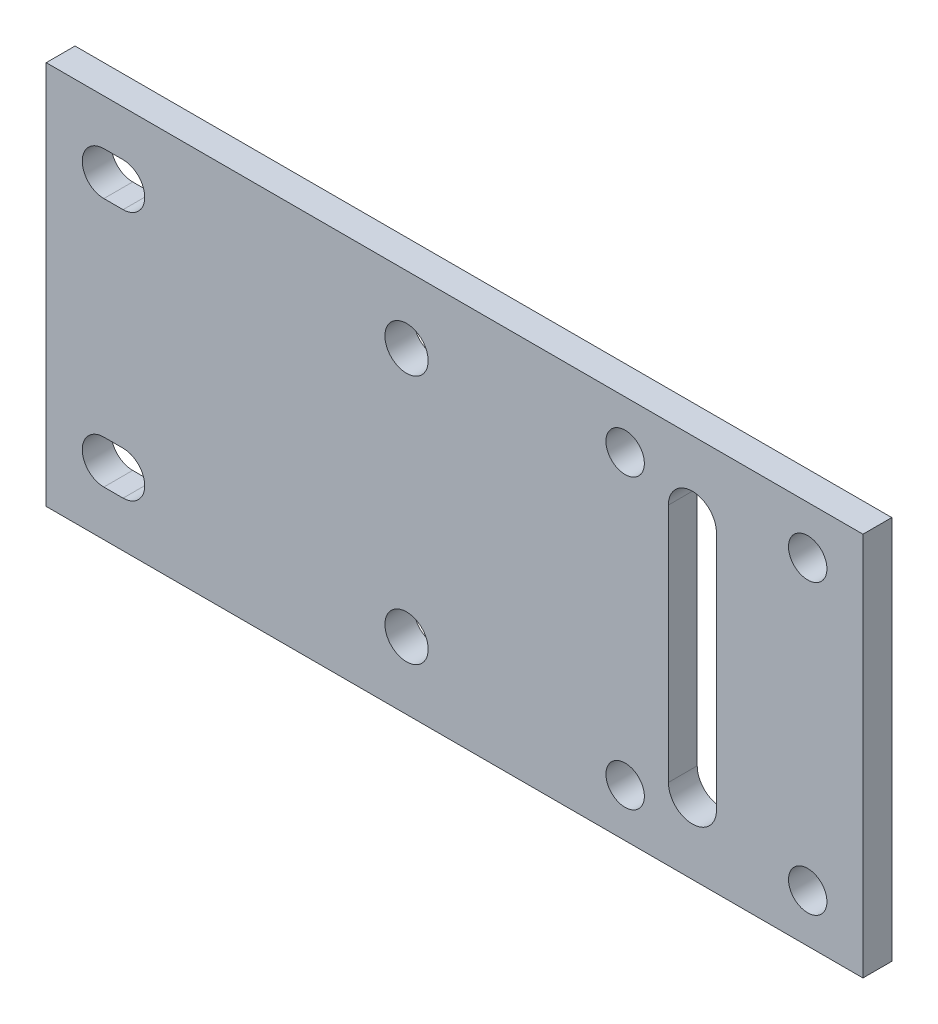
ISO-10303-21;
HEADER;
FILE_DESCRIPTION(('STEP AP214'),'2;1');
FILE_NAME('part.step','',(''),(''),'','','');
FILE_SCHEMA(('AUTOMOTIVE_DESIGN { 1 0 10303 214 1 1 1 1 }'));
ENDSEC;
DATA;
#1=APPLICATION_CONTEXT('core data for automotive mechanical design processes');
#2=APPLICATION_PROTOCOL_DEFINITION('international standard','automotive_design',2000,#1);
#3=PRODUCT_CONTEXT('',#1,'mechanical');
#4=PRODUCT('Part','Part','',(#3));
#5=PRODUCT_RELATED_PRODUCT_CATEGORY('part','',(#4));
#6=PRODUCT_DEFINITION_FORMATION('','',#4);
#7=PRODUCT_DEFINITION_CONTEXT('part definition',#1,'design');
#8=PRODUCT_DEFINITION('design','',#6,#7);
#9=PRODUCT_DEFINITION_SHAPE('','',#8);
#10=(LENGTH_UNIT() NAMED_UNIT(*) SI_UNIT(.MILLI.,.METRE.));
#11=(NAMED_UNIT(*) PLANE_ANGLE_UNIT() SI_UNIT($,.RADIAN.));
#12=(NAMED_UNIT(*) SI_UNIT($,.STERADIAN.) SOLID_ANGLE_UNIT());
#13=UNCERTAINTY_MEASURE_WITH_UNIT(LENGTH_MEASURE(1.E-05),#10,'distance_accuracy_value','');
#14=(GEOMETRIC_REPRESENTATION_CONTEXT(3) GLOBAL_UNCERTAINTY_ASSIGNED_CONTEXT((#13)) GLOBAL_UNIT_ASSIGNED_CONTEXT((#10,
#11,#12)) REPRESENTATION_CONTEXT('',''));
#15=CARTESIAN_POINT('',(0.,0.,0.));
#16=DIRECTION('',(0.,0.,1.));
#17=DIRECTION('',(1.,0.,0.));
#18=AXIS2_PLACEMENT_3D('',#15,#16,#17);
#19=CARTESIAN_POINT('',(0.,0.,3.));
#20=DIRECTION('',(0.,0.,1.));
#21=DIRECTION('',(1.,0.,0.));
#22=AXIS2_PLACEMENT_3D('',#19,#20,#21);
#23=PLANE('',#22);
#24=CARTESIAN_POINT('',(57.,-15.,3.));
#25=DIRECTION('',(0.,0.,1.));
#26=DIRECTION('',(-1.,0.,0.));
#27=AXIS2_PLACEMENT_3D('',#24,#25,#26);
#28=CIRCLE('',#27,2.);
#29=CARTESIAN_POINT('',(55.,-15.,3.));
#30=VERTEX_POINT('',#29);
#31=EDGE_CURVE('E475',#30,#30,#28,.T.);
#32=ORIENTED_EDGE('',*,*,#31,.F.);
#33=EDGE_LOOP('',(#32));
#34=FACE_BOUND('',#33,.T.);
#35=CARTESIAN_POINT('',(57.,15.,3.));
#36=DIRECTION('',(0.,0.,1.));
#37=DIRECTION('',(1.,0.,0.));
#38=AXIS2_PLACEMENT_3D('',#35,#36,#37);
#39=CIRCLE('',#38,2.);
#40=CARTESIAN_POINT('',(59.,15.,3.));
#41=VERTEX_POINT('',#40);
#42=EDGE_CURVE('E188',#41,#41,#39,.T.);
#43=ORIENTED_EDGE('',*,*,#42,.F.);
#44=EDGE_LOOP('',(#43));
#45=FACE_BOUND('',#44,.T.);
#46=CARTESIAN_POINT('',(15.25,13.,3.));
#47=DIRECTION('',(0.,0.,1.));
#48=DIRECTION('',(1.,0.,0.));
#49=AXIS2_PLACEMENT_3D('',#46,#47,#48);
#50=CIRCLE('',#49,2.25);
#51=CARTESIAN_POINT('',(17.5,13.,3.));
#52=VERTEX_POINT('',#51);
#53=EDGE_CURVE('E298',#52,#52,#50,.T.);
#54=ORIENTED_EDGE('',*,*,#53,.F.);
#55=EDGE_LOOP('',(#54));
#56=FACE_BOUND('',#55,.T.);
#57=DIRECTION('',(0.,-1.,0.));
#58=VECTOR('',#57,1.);
#59=CARTESIAN_POINT('',(-22.25,-20.,3.));
#60=LINE('',#59,#58);
#61=CARTESIAN_POINT('',(-22.25,20.,3.));
#62=VERTEX_POINT('',#61);
#63=CARTESIAN_POINT('',(-22.25,-20.,3.));
#64=VERTEX_POINT('',#63);
#65=EDGE_CURVE('E306',#62,#64,#60,.T.);
#66=ORIENTED_EDGE('',*,*,#65,.T.);
#67=DIRECTION('',(1.,0.,0.));
#68=VECTOR('',#67,1.);
#69=CARTESIAN_POINT('',(62.75,-20.,3.));
#70=LINE('',#69,#68);
#71=CARTESIAN_POINT('',(62.75,-20.,3.));
#72=VERTEX_POINT('',#71);
#73=EDGE_CURVE('E310',#64,#72,#70,.T.);
#74=ORIENTED_EDGE('',*,*,#73,.T.);
#75=DIRECTION('',(0.,1.,0.));
#76=VECTOR('',#75,1.);
#77=CARTESIAN_POINT('',(62.75,-20.,3.));
#78=LINE('',#77,#76);
#79=CARTESIAN_POINT('',(62.75,20.,3.));
#80=VERTEX_POINT('',#79);
#81=EDGE_CURVE('E314',#72,#80,#78,.T.);
#82=ORIENTED_EDGE('',*,*,#81,.T.);
#83=DIRECTION('',(-1.,0.,0.));
#84=VECTOR('',#83,1.);
#85=CARTESIAN_POINT('',(62.75,20.,3.));
#86=LINE('',#85,#84);
#87=EDGE_CURVE('E317',#80,#62,#86,.T.);
#88=ORIENTED_EDGE('',*,*,#87,.T.);
#89=EDGE_LOOP('',(#66,#74,#82,#88));
#90=FACE_BOUND('',#89,.T.);
#91=CARTESIAN_POINT('',(15.25,-13.,3.));
#92=DIRECTION('',(0.,0.,1.));
#93=DIRECTION('',(1.,0.,0.));
#94=AXIS2_PLACEMENT_3D('',#91,#92,#93);
#95=CIRCLE('',#94,2.25);
#96=CARTESIAN_POINT('',(17.5,-13.,3.));
#97=VERTEX_POINT('',#96);
#98=EDGE_CURVE('E290',#97,#97,#95,.T.);
#99=ORIENTED_EDGE('',*,*,#98,.F.);
#100=EDGE_LOOP('',(#99));
#101=FACE_BOUND('',#100,.T.);
#102=DIRECTION('',(-1.,0.,0.));
#103=VECTOR('',#102,1.);
#104=CARTESIAN_POINT('',(-14.25,15.25,3.));
#105=LINE('',#104,#103);
#106=CARTESIAN_POINT('',(-14.25,15.25,3.));
#107=VERTEX_POINT('',#106);
#108=CARTESIAN_POINT('',(-16.25,15.25,3.));
#109=VERTEX_POINT('',#108);
#110=EDGE_CURVE('E250',#107,#109,#105,.T.);
#111=ORIENTED_EDGE('',*,*,#110,.F.);
#112=CARTESIAN_POINT('',(-14.25,13.,3.));
#113=DIRECTION('',(0.,0.,1.));
#114=DIRECTION('',(1.,0.,0.));
#115=AXIS2_PLACEMENT_3D('',#112,#113,#114);
#116=CIRCLE('',#115,2.25);
#117=CARTESIAN_POINT('',(-14.25,10.75,3.));
#118=VERTEX_POINT('',#117);
#119=EDGE_CURVE('E247',#118,#107,#116,.T.);
#120=ORIENTED_EDGE('',*,*,#119,.F.);
#121=DIRECTION('',(1.,0.,0.));
#122=VECTOR('',#121,1.);
#123=CARTESIAN_POINT('',(-14.25,10.75,3.));
#124=LINE('',#123,#122);
#125=CARTESIAN_POINT('',(-16.25,10.75,3.));
#126=VERTEX_POINT('',#125);
#127=EDGE_CURVE('E258',#126,#118,#124,.T.);
#128=ORIENTED_EDGE('',*,*,#127,.F.);
#129=CARTESIAN_POINT('',(-16.25,13.,3.));
#130=DIRECTION('',(0.,0.,1.));
#131=DIRECTION('',(1.,0.,0.));
#132=AXIS2_PLACEMENT_3D('',#129,#130,#131);
#133=CIRCLE('',#132,2.25);
#134=EDGE_CURVE('E254',#109,#126,#133,.T.);
#135=ORIENTED_EDGE('',*,*,#134,.F.);
#136=EDGE_LOOP('',(#111,#120,#128,#135));
#137=FACE_BOUND('',#136,.T.);
#138=DIRECTION('',(-1.,0.,0.));
#139=VECTOR('',#138,1.);
#140=CARTESIAN_POINT('',(-14.25,-10.75,3.));
#141=LINE('',#140,#139);
#142=CARTESIAN_POINT('',(-14.25,-10.75,3.));
#143=VERTEX_POINT('',#142);
#144=CARTESIAN_POINT('',(-16.25,-10.75,3.));
#145=VERTEX_POINT('',#144);
#146=EDGE_CURVE('E207',#143,#145,#141,.T.);
#147=ORIENTED_EDGE('',*,*,#146,.F.);
#148=CARTESIAN_POINT('',(-14.25,-13.,3.));
#149=DIRECTION('',(0.,0.,1.));
#150=DIRECTION('',(1.,0.,0.));
#151=AXIS2_PLACEMENT_3D('',#148,#149,#150);
#152=CIRCLE('',#151,2.25);
#153=CARTESIAN_POINT('',(-14.25,-15.25,3.));
#154=VERTEX_POINT('',#153);
#155=EDGE_CURVE('E204',#154,#143,#152,.T.);
#156=ORIENTED_EDGE('',*,*,#155,.F.);
#157=DIRECTION('',(1.,0.,0.));
#158=VECTOR('',#157,1.);
#159=CARTESIAN_POINT('',(-14.25,-15.25,3.));
#160=LINE('',#159,#158);
#161=CARTESIAN_POINT('',(-16.25,-15.25,3.));
#162=VERTEX_POINT('',#161);
#163=EDGE_CURVE('E215',#162,#154,#160,.T.);
#164=ORIENTED_EDGE('',*,*,#163,.F.);
#165=CARTESIAN_POINT('',(-16.25,-13.,3.));
#166=DIRECTION('',(0.,0.,1.));
#167=DIRECTION('',(1.,0.,0.));
#168=AXIS2_PLACEMENT_3D('',#165,#166,#167);
#169=CIRCLE('',#168,2.25);
#170=EDGE_CURVE('E211',#145,#162,#169,.T.);
#171=ORIENTED_EDGE('',*,*,#170,.F.);
#172=EDGE_LOOP('',(#147,#156,#164,#171));
#173=FACE_BOUND('',#172,.T.);
#174=DIRECTION('',(0.,1.,0.));
#175=VECTOR('',#174,1.);
#176=CARTESIAN_POINT('',(47.5,-12.5,3.));
#177=LINE('',#176,#175);
#178=CARTESIAN_POINT('',(47.5,-12.5,3.));
#179=VERTEX_POINT('',#178);
#180=CARTESIAN_POINT('',(47.5,12.5,3.));
#181=VERTEX_POINT('',#180);
#182=EDGE_CURVE('E162',#179,#181,#177,.T.);
#183=ORIENTED_EDGE('',*,*,#182,.F.);
#184=CARTESIAN_POINT('',(45.,-12.5,3.));
#185=DIRECTION('',(0.,0.,1.));
#186=DIRECTION('',(1.,0.,0.));
#187=AXIS2_PLACEMENT_3D('',#184,#185,#186);
#188=CIRCLE('',#187,2.5);
#189=CARTESIAN_POINT('',(42.5,-12.5,3.));
#190=VERTEX_POINT('',#189);
#191=EDGE_CURVE('E153',#190,#179,#188,.T.);
#192=ORIENTED_EDGE('',*,*,#191,.F.);
#193=DIRECTION('',(0.,-1.,0.));
#194=VECTOR('',#193,1.);
#195=CARTESIAN_POINT('',(42.5,-12.5,3.));
#196=LINE('',#195,#194);
#197=CARTESIAN_POINT('',(42.5,12.5,3.));
#198=VERTEX_POINT('',#197);
#199=EDGE_CURVE('E180',#198,#190,#196,.T.);
#200=ORIENTED_EDGE('',*,*,#199,.F.);
#201=CARTESIAN_POINT('',(45.,12.5,3.));
#202=DIRECTION('',(0.,0.,1.));
#203=DIRECTION('',(1.,0.,0.));
#204=AXIS2_PLACEMENT_3D('',#201,#202,#203);
#205=CIRCLE('',#204,2.5);
#206=EDGE_CURVE('E176',#181,#198,#205,.T.);
#207=ORIENTED_EDGE('',*,*,#206,.F.);
#208=EDGE_LOOP('',(#183,#192,#200,#207));
#209=FACE_BOUND('',#208,.T.);
#210=CARTESIAN_POINT('',(38.,15.,3.));
#211=DIRECTION('',(0.,0.,1.));
#212=DIRECTION('',(1.,0.,0.));
#213=AXIS2_PLACEMENT_3D('',#210,#211,#212);
#214=CIRCLE('',#213,2.);
#215=CARTESIAN_POINT('',(40.,15.,3.));
#216=VERTEX_POINT('',#215);
#217=EDGE_CURVE('E483',#216,#216,#214,.T.);
#218=ORIENTED_EDGE('',*,*,#217,.F.);
#219=EDGE_LOOP('',(#218));
#220=FACE_BOUND('',#219,.T.);
#221=CARTESIAN_POINT('',(38.,-15.,3.));
#222=DIRECTION('',(0.,0.,1.));
#223=DIRECTION('',(-1.,0.,0.));
#224=AXIS2_PLACEMENT_3D('',#221,#222,#223);
#225=CIRCLE('',#224,2.);
#226=CARTESIAN_POINT('',(36.,-15.,3.));
#227=VERTEX_POINT('',#226);
#228=EDGE_CURVE('E464',#227,#227,#225,.T.);
#229=ORIENTED_EDGE('',*,*,#228,.F.);
#230=EDGE_LOOP('',(#229));
#231=FACE_BOUND('',#230,.T.);
#232=ADVANCED_FACE('F39',(#34,#45,#56,#90,#101,#137,#173,#209,#220,#231),#23,.T.);
#233=CARTESIAN_POINT('',(0.,0.,0.));
#234=DIRECTION('',(0.,0.,1.));
#235=DIRECTION('',(1.,0.,0.));
#236=AXIS2_PLACEMENT_3D('',#233,#234,#235);
#237=PLANE('',#236);
#238=CARTESIAN_POINT('',(-14.25,-13.,0.));
#239=DIRECTION('',(0.,0.,1.));
#240=DIRECTION('',(1.,0.,0.));
#241=AXIS2_PLACEMENT_3D('',#238,#239,#240);
#242=CIRCLE('',#241,2.25);
#243=CARTESIAN_POINT('',(-14.25,-15.25,0.));
#244=VERTEX_POINT('',#243);
#245=CARTESIAN_POINT('',(-14.25,-10.75,0.));
#246=VERTEX_POINT('',#245);
#247=EDGE_CURVE('E171',#244,#246,#242,.T.);
#248=ORIENTED_EDGE('',*,*,#247,.T.);
#249=DIRECTION('',(-1.,0.,0.));
#250=VECTOR('',#249,1.);
#251=CARTESIAN_POINT('',(-14.25,-10.75,0.));
#252=LINE('',#251,#250);
#253=CARTESIAN_POINT('',(-16.25,-10.75,0.));
#254=VERTEX_POINT('',#253);
#255=EDGE_CURVE('E222',#246,#254,#252,.T.);
#256=ORIENTED_EDGE('',*,*,#255,.T.);
#257=CARTESIAN_POINT('',(-16.25,-13.,0.));
#258=DIRECTION('',(0.,0.,1.));
#259=DIRECTION('',(1.,0.,0.));
#260=AXIS2_PLACEMENT_3D('',#257,#258,#259);
#261=CIRCLE('',#260,2.25);
#262=CARTESIAN_POINT('',(-16.25,-15.25,0.));
#263=VERTEX_POINT('',#262);
#264=EDGE_CURVE('E226',#254,#263,#261,.T.);
#265=ORIENTED_EDGE('',*,*,#264,.T.);
#266=DIRECTION('',(1.,0.,0.));
#267=VECTOR('',#266,1.);
#268=CARTESIAN_POINT('',(-14.25,-15.25,0.));
#269=LINE('',#268,#267);
#270=EDGE_CURVE('E208',#263,#244,#269,.T.);
#271=ORIENTED_EDGE('',*,*,#270,.T.);
#272=EDGE_LOOP('',(#248,#256,#265,#271));
#273=FACE_BOUND('',#272,.T.);
#274=CARTESIAN_POINT('',(15.25,-13.,0.));
#275=DIRECTION('',(0.,0.,1.));
#276=DIRECTION('',(1.,0.,0.));
#277=AXIS2_PLACEMENT_3D('',#274,#275,#276);
#278=CIRCLE('',#277,2.25);
#279=CARTESIAN_POINT('',(17.5,-13.,0.));
#280=VERTEX_POINT('',#279);
#281=EDGE_CURVE('E289',#280,#280,#278,.T.);
#282=ORIENTED_EDGE('',*,*,#281,.T.);
#283=EDGE_LOOP('',(#282));
#284=FACE_BOUND('',#283,.T.);
#285=CARTESIAN_POINT('',(15.25,13.,0.));
#286=DIRECTION('',(0.,0.,1.));
#287=DIRECTION('',(1.,0.,0.));
#288=AXIS2_PLACEMENT_3D('',#285,#286,#287);
#289=CIRCLE('',#288,2.25);
#290=CARTESIAN_POINT('',(17.5,13.,0.));
#291=VERTEX_POINT('',#290);
#292=EDGE_CURVE('E294',#291,#291,#289,.T.);
#293=ORIENTED_EDGE('',*,*,#292,.T.);
#294=EDGE_LOOP('',(#293));
#295=FACE_BOUND('',#294,.T.);
#296=DIRECTION('',(0.,-1.,0.));
#297=VECTOR('',#296,1.);
#298=CARTESIAN_POINT('',(-22.25,-20.,0.));
#299=LINE('',#298,#297);
#300=CARTESIAN_POINT('',(-22.25,20.,0.));
#301=VERTEX_POINT('',#300);
#302=CARTESIAN_POINT('',(-22.25,-20.,0.));
#303=VERTEX_POINT('',#302);
#304=EDGE_CURVE('E302',#301,#303,#299,.T.);
#305=ORIENTED_EDGE('',*,*,#304,.F.);
#306=DIRECTION('',(-1.,0.,0.));
#307=VECTOR('',#306,1.);
#308=CARTESIAN_POINT('',(62.75,20.,0.));
#309=LINE('',#308,#307);
#310=CARTESIAN_POINT('',(62.75,20.,0.));
#311=VERTEX_POINT('',#310);
#312=EDGE_CURVE('E311',#311,#301,#309,.T.);
#313=ORIENTED_EDGE('',*,*,#312,.F.);
#314=DIRECTION('',(0.,1.,0.));
#315=VECTOR('',#314,1.);
#316=CARTESIAN_POINT('',(62.75,-20.,0.));
#317=LINE('',#316,#315);
#318=CARTESIAN_POINT('',(62.75,-20.,0.));
#319=VERTEX_POINT('',#318);
#320=EDGE_CURVE('E327',#319,#311,#317,.T.);
#321=ORIENTED_EDGE('',*,*,#320,.F.);
#322=DIRECTION('',(1.,0.,0.));
#323=VECTOR('',#322,1.);
#324=CARTESIAN_POINT('',(62.75,-20.,0.));
#325=LINE('',#324,#323);
#326=EDGE_CURVE('E324',#303,#319,#325,.T.);
#327=ORIENTED_EDGE('',*,*,#326,.F.);
#328=EDGE_LOOP('',(#305,#313,#321,#327));
#329=FACE_BOUND('',#328,.T.);
#330=CARTESIAN_POINT('',(-14.25,13.,0.));
#331=DIRECTION('',(0.,0.,1.));
#332=DIRECTION('',(1.,0.,0.));
#333=AXIS2_PLACEMENT_3D('',#330,#331,#332);
#334=CIRCLE('',#333,2.25);
#335=CARTESIAN_POINT('',(-14.25,10.75,0.));
#336=VERTEX_POINT('',#335);
#337=CARTESIAN_POINT('',(-14.25,15.25,0.));
#338=VERTEX_POINT('',#337);
#339=EDGE_CURVE('E246',#336,#338,#334,.T.);
#340=ORIENTED_EDGE('',*,*,#339,.T.);
#341=DIRECTION('',(-1.,0.,0.));
#342=VECTOR('',#341,1.);
#343=CARTESIAN_POINT('',(-14.25,15.25,0.));
#344=LINE('',#343,#342);
#345=CARTESIAN_POINT('',(-16.25,15.25,0.));
#346=VERTEX_POINT('',#345);
#347=EDGE_CURVE('E265',#338,#346,#344,.T.);
#348=ORIENTED_EDGE('',*,*,#347,.T.);
#349=CARTESIAN_POINT('',(-16.25,13.,0.));
#350=DIRECTION('',(0.,0.,1.));
#351=DIRECTION('',(1.,0.,0.));
#352=AXIS2_PLACEMENT_3D('',#349,#350,#351);
#353=CIRCLE('',#352,2.25);
#354=CARTESIAN_POINT('',(-16.25,10.75,0.));
#355=VERTEX_POINT('',#354);
#356=EDGE_CURVE('E269',#346,#355,#353,.T.);
#357=ORIENTED_EDGE('',*,*,#356,.T.);
#358=DIRECTION('',(1.,0.,0.));
#359=VECTOR('',#358,1.);
#360=CARTESIAN_POINT('',(-14.25,10.75,0.));
#361=LINE('',#360,#359);
#362=EDGE_CURVE('E251',#355,#336,#361,.T.);
#363=ORIENTED_EDGE('',*,*,#362,.T.);
#364=EDGE_LOOP('',(#340,#348,#357,#363));
#365=FACE_BOUND('',#364,.T.);
#366=CARTESIAN_POINT('',(45.,-12.5,0.));
#367=DIRECTION('',(0.,0.,1.));
#368=DIRECTION('',(1.,0.,0.));
#369=AXIS2_PLACEMENT_3D('',#366,#367,#368);
#370=CIRCLE('',#369,2.5);
#371=CARTESIAN_POINT('',(42.5,-12.5,0.));
#372=VERTEX_POINT('',#371);
#373=CARTESIAN_POINT('',(47.5,-12.5,0.));
#374=VERTEX_POINT('',#373);
#375=EDGE_CURVE('E63',#372,#374,#370,.T.);
#376=ORIENTED_EDGE('',*,*,#375,.T.);
#377=DIRECTION('',(0.,1.,0.));
#378=VECTOR('',#377,1.);
#379=CARTESIAN_POINT('',(47.5,-12.5,0.));
#380=LINE('',#379,#378);
#381=CARTESIAN_POINT('',(47.5,12.5,0.));
#382=VERTEX_POINT('',#381);
#383=EDGE_CURVE('E169',#374,#382,#380,.T.);
#384=ORIENTED_EDGE('',*,*,#383,.T.);
#385=CARTESIAN_POINT('',(45.,12.5,0.));
#386=DIRECTION('',(0.,0.,1.));
#387=DIRECTION('',(1.,0.,0.));
#388=AXIS2_PLACEMENT_3D('',#385,#386,#387);
#389=CIRCLE('',#388,2.5);
#390=CARTESIAN_POINT('',(42.5,12.5,0.));
#391=VERTEX_POINT('',#390);
#392=EDGE_CURVE('E191',#382,#391,#389,.T.);
#393=ORIENTED_EDGE('',*,*,#392,.T.);
#394=DIRECTION('',(0.,-1.,0.));
#395=VECTOR('',#394,1.);
#396=CARTESIAN_POINT('',(42.5,-12.5,0.));
#397=LINE('',#396,#395);
#398=EDGE_CURVE('E163',#391,#372,#397,.T.);
#399=ORIENTED_EDGE('',*,*,#398,.T.);
#400=EDGE_LOOP('',(#376,#384,#393,#399));
#401=FACE_BOUND('',#400,.T.);
#402=CARTESIAN_POINT('',(57.,15.,0.));
#403=DIRECTION('',(0.,0.,1.));
#404=DIRECTION('',(1.,0.,0.));
#405=AXIS2_PLACEMENT_3D('',#402,#403,#404);
#406=CIRCLE('',#405,2.);
#407=CARTESIAN_POINT('',(59.,15.,0.));
#408=VERTEX_POINT('',#407);
#409=EDGE_CURVE('E487',#408,#408,#406,.T.);
#410=ORIENTED_EDGE('',*,*,#409,.T.);
#411=EDGE_LOOP('',(#410));
#412=FACE_BOUND('',#411,.T.);
#413=CARTESIAN_POINT('',(38.,15.,0.));
#414=DIRECTION('',(0.,0.,1.));
#415=DIRECTION('',(1.,0.,0.));
#416=AXIS2_PLACEMENT_3D('',#413,#414,#415);
#417=CIRCLE('',#416,2.);
#418=CARTESIAN_POINT('',(40.,15.,0.));
#419=VERTEX_POINT('',#418);
#420=EDGE_CURVE('E479',#419,#419,#417,.T.);
#421=ORIENTED_EDGE('',*,*,#420,.T.);
#422=EDGE_LOOP('',(#421));
#423=FACE_BOUND('',#422,.T.);
#424=CARTESIAN_POINT('',(57.,-15.,0.));
#425=DIRECTION('',(0.,0.,1.));
#426=DIRECTION('',(-1.,0.,0.));
#427=AXIS2_PLACEMENT_3D('',#424,#425,#426);
#428=CIRCLE('',#427,2.);
#429=CARTESIAN_POINT('',(55.,-15.,0.));
#430=VERTEX_POINT('',#429);
#431=EDGE_CURVE('E472',#430,#430,#428,.T.);
#432=ORIENTED_EDGE('',*,*,#431,.T.);
#433=EDGE_LOOP('',(#432));
#434=FACE_BOUND('',#433,.T.);
#435=CARTESIAN_POINT('',(38.,-15.,0.));
#436=DIRECTION('',(0.,0.,1.));
#437=DIRECTION('',(-1.,0.,0.));
#438=AXIS2_PLACEMENT_3D('',#435,#436,#437);
#439=CIRCLE('',#438,2.);
#440=CARTESIAN_POINT('',(36.,-15.,0.));
#441=VERTEX_POINT('',#440);
#442=EDGE_CURVE('E467',#441,#441,#439,.T.);
#443=ORIENTED_EDGE('',*,*,#442,.T.);
#444=EDGE_LOOP('',(#443));
#445=FACE_BOUND('',#444,.T.);
#446=ADVANCED_FACE('F350',(#273,#284,#295,#329,#365,#401,#412,#423,#434,#445),#237,.F.);
#447=CARTESIAN_POINT('',(-22.25,-20.,3.));
#448=DIRECTION('',(1.,0.,0.));
#449=DIRECTION('',(0.,0.,-1.));
#450=AXIS2_PLACEMENT_3D('',#447,#448,#449);
#451=PLANE('',#450);
#452=ORIENTED_EDGE('',*,*,#304,.T.);
#453=DIRECTION('',(0.,0.,-1.));
#454=VECTOR('',#453,1.);
#455=CARTESIAN_POINT('',(-22.25,-20.,3.));
#456=LINE('',#455,#454);
#457=EDGE_CURVE('E11',#64,#303,#456,.T.);
#458=ORIENTED_EDGE('',*,*,#457,.F.);
#459=ORIENTED_EDGE('',*,*,#65,.F.);
#460=DIRECTION('',(0.,0.,-1.));
#461=VECTOR('',#460,1.);
#462=CARTESIAN_POINT('',(-22.25,20.,3.));
#463=LINE('',#462,#461);
#464=EDGE_CURVE('E320',#62,#301,#463,.T.);
#465=ORIENTED_EDGE('',*,*,#464,.T.);
#466=EDGE_LOOP('',(#452,#458,#459,#465));
#467=FACE_BOUND('',#466,.T.);
#468=ADVANCED_FACE('F41',(#467),#451,.F.);
#469=CARTESIAN_POINT('',(62.75,-20.,3.));
#470=DIRECTION('',(0.,1.,0.));
#471=DIRECTION('',(-1.,0.,0.));
#472=AXIS2_PLACEMENT_3D('',#469,#470,#471);
#473=PLANE('',#472);
#474=ORIENTED_EDGE('',*,*,#326,.T.);
#475=DIRECTION('',(0.,0.,-1.));
#476=VECTOR('',#475,1.);
#477=CARTESIAN_POINT('',(62.75,-20.,3.));
#478=LINE('',#477,#476);
#479=EDGE_CURVE('E48',#72,#319,#478,.T.);
#480=ORIENTED_EDGE('',*,*,#479,.F.);
#481=ORIENTED_EDGE('',*,*,#73,.F.);
#482=ORIENTED_EDGE('',*,*,#457,.T.);
#483=EDGE_LOOP('',(#474,#480,#481,#482));
#484=FACE_BOUND('',#483,.T.);
#485=ADVANCED_FACE('F361',(#484),#473,.F.);
#486=CARTESIAN_POINT('',(62.75,-20.,3.));
#487=DIRECTION('',(-1.,0.,0.));
#488=DIRECTION('',(0.,0.,1.));
#489=AXIS2_PLACEMENT_3D('',#486,#487,#488);
#490=PLANE('',#489);
#491=ORIENTED_EDGE('',*,*,#320,.T.);
#492=DIRECTION('',(0.,0.,-1.));
#493=VECTOR('',#492,1.);
#494=CARTESIAN_POINT('',(62.75,20.,3.));
#495=LINE('',#494,#493);
#496=EDGE_CURVE('E335',#80,#311,#495,.T.);
#497=ORIENTED_EDGE('',*,*,#496,.F.);
#498=ORIENTED_EDGE('',*,*,#81,.F.);
#499=ORIENTED_EDGE('',*,*,#479,.T.);
#500=EDGE_LOOP('',(#491,#497,#498,#499));
#501=FACE_BOUND('',#500,.T.);
#502=ADVANCED_FACE('F344',(#501),#490,.F.);
#503=CARTESIAN_POINT('',(62.75,20.,3.));
#504=DIRECTION('',(0.,-1.,0.));
#505=DIRECTION('',(1.,0.,0.));
#506=AXIS2_PLACEMENT_3D('',#503,#504,#505);
#507=PLANE('',#506);
#508=ORIENTED_EDGE('',*,*,#312,.T.);
#509=ORIENTED_EDGE('',*,*,#464,.F.);
#510=ORIENTED_EDGE('',*,*,#87,.F.);
#511=ORIENTED_EDGE('',*,*,#496,.T.);
#512=EDGE_LOOP('',(#508,#509,#510,#511));
#513=FACE_BOUND('',#512,.T.);
#514=ADVANCED_FACE('F354',(#513),#507,.F.);
#515=CARTESIAN_POINT('',(15.25,13.,3.));
#516=DIRECTION('',(0.,0.,-1.));
#517=DIRECTION('',(-1.,0.,0.));
#518=AXIS2_PLACEMENT_3D('',#515,#516,#517);
#519=CYLINDRICAL_SURFACE('',#518,2.25);
#520=ORIENTED_EDGE('',*,*,#53,.T.);
#521=EDGE_LOOP('',(#520));
#522=FACE_BOUND('',#521,.T.);
#523=ORIENTED_EDGE('',*,*,#292,.F.);
#524=EDGE_LOOP('',(#523));
#525=FACE_BOUND('',#524,.T.);
#526=ADVANCED_FACE('F379',(#522,#525),#519,.F.);
#527=CARTESIAN_POINT('',(15.25,-13.,3.));
#528=DIRECTION('',(0.,0.,-1.));
#529=DIRECTION('',(-1.,0.,0.));
#530=AXIS2_PLACEMENT_3D('',#527,#528,#529);
#531=CYLINDRICAL_SURFACE('',#530,2.25);
#532=ORIENTED_EDGE('',*,*,#98,.T.);
#533=EDGE_LOOP('',(#532));
#534=FACE_BOUND('',#533,.T.);
#535=ORIENTED_EDGE('',*,*,#281,.F.);
#536=EDGE_LOOP('',(#535));
#537=FACE_BOUND('',#536,.T.);
#538=ADVANCED_FACE('F386',(#534,#537),#531,.F.);
#539=CARTESIAN_POINT('',(-14.25,13.,3.));
#540=DIRECTION('',(0.,0.,-1.));
#541=DIRECTION('',(-1.,0.,0.));
#542=AXIS2_PLACEMENT_3D('',#539,#540,#541);
#543=CYLINDRICAL_SURFACE('',#542,2.25);
#544=ORIENTED_EDGE('',*,*,#339,.F.);
#545=DIRECTION('',(0.,0.,-1.));
#546=VECTOR('',#545,1.);
#547=CARTESIAN_POINT('',(-14.25,10.75,3.));
#548=LINE('',#547,#546);
#549=EDGE_CURVE('E261',#118,#336,#548,.T.);
#550=ORIENTED_EDGE('',*,*,#549,.F.);
#551=ORIENTED_EDGE('',*,*,#119,.T.);
#552=DIRECTION('',(0.,0.,-1.));
#553=VECTOR('',#552,1.);
#554=CARTESIAN_POINT('',(-14.25,15.25,3.));
#555=LINE('',#554,#553);
#556=EDGE_CURVE('E285',#107,#338,#555,.T.);
#557=ORIENTED_EDGE('',*,*,#556,.T.);
#558=EDGE_LOOP('',(#544,#550,#551,#557));
#559=FACE_BOUND('',#558,.T.);
#560=ADVANCED_FACE('F391',(#559),#543,.F.);
#561=CARTESIAN_POINT('',(-14.25,15.25,3.));
#562=DIRECTION('',(0.,-1.,0.));
#563=DIRECTION('',(0.,0.,-1.));
#564=AXIS2_PLACEMENT_3D('',#561,#562,#563);
#565=PLANE('',#564);
#566=ORIENTED_EDGE('',*,*,#347,.F.);
#567=ORIENTED_EDGE('',*,*,#556,.F.);
#568=ORIENTED_EDGE('',*,*,#110,.T.);
#569=DIRECTION('',(0.,0.,-1.));
#570=VECTOR('',#569,1.);
#571=CARTESIAN_POINT('',(-16.25,15.25,3.));
#572=LINE('',#571,#570);
#573=EDGE_CURVE('E282',#109,#346,#572,.T.);
#574=ORIENTED_EDGE('',*,*,#573,.T.);
#575=EDGE_LOOP('',(#566,#567,#568,#574));
#576=FACE_BOUND('',#575,.T.);
#577=ADVANCED_FACE('F401',(#576),#565,.T.);
#578=CARTESIAN_POINT('',(-16.25,13.,3.));
#579=DIRECTION('',(0.,0.,-1.));
#580=DIRECTION('',(-1.,0.,0.));
#581=AXIS2_PLACEMENT_3D('',#578,#579,#580);
#582=CYLINDRICAL_SURFACE('',#581,2.25);
#583=ORIENTED_EDGE('',*,*,#356,.F.);
#584=ORIENTED_EDGE('',*,*,#573,.F.);
#585=ORIENTED_EDGE('',*,*,#134,.T.);
#586=DIRECTION('',(0.,0.,-1.));
#587=VECTOR('',#586,1.);
#588=CARTESIAN_POINT('',(-16.25,10.75,3.));
#589=LINE('',#588,#587);
#590=EDGE_CURVE('E279',#126,#355,#589,.T.);
#591=ORIENTED_EDGE('',*,*,#590,.T.);
#592=EDGE_LOOP('',(#583,#584,#585,#591));
#593=FACE_BOUND('',#592,.T.);
#594=ADVANCED_FACE('F408',(#593),#582,.F.);
#595=CARTESIAN_POINT('',(-14.25,10.75,3.));
#596=DIRECTION('',(0.,1.,0.));
#597=DIRECTION('',(0.,0.,1.));
#598=AXIS2_PLACEMENT_3D('',#595,#596,#597);
#599=PLANE('',#598);
#600=ORIENTED_EDGE('',*,*,#362,.F.);
#601=ORIENTED_EDGE('',*,*,#590,.F.);
#602=ORIENTED_EDGE('',*,*,#127,.T.);
#603=ORIENTED_EDGE('',*,*,#549,.T.);
#604=EDGE_LOOP('',(#600,#601,#602,#603));
#605=FACE_BOUND('',#604,.T.);
#606=ADVANCED_FACE('F412',(#605),#599,.T.);
#607=CARTESIAN_POINT('',(-14.25,-13.,3.));
#608=DIRECTION('',(0.,0.,-1.));
#609=DIRECTION('',(-1.,0.,0.));
#610=AXIS2_PLACEMENT_3D('',#607,#608,#609);
#611=CYLINDRICAL_SURFACE('',#610,2.25);
#612=ORIENTED_EDGE('',*,*,#247,.F.);
#613=DIRECTION('',(0.,0.,-1.));
#614=VECTOR('',#613,1.);
#615=CARTESIAN_POINT('',(-14.25,-15.25,3.));
#616=LINE('',#615,#614);
#617=EDGE_CURVE('E218',#154,#244,#616,.T.);
#618=ORIENTED_EDGE('',*,*,#617,.F.);
#619=ORIENTED_EDGE('',*,*,#155,.T.);
#620=DIRECTION('',(0.,0.,-1.));
#621=VECTOR('',#620,1.);
#622=CARTESIAN_POINT('',(-14.25,-10.75,3.));
#623=LINE('',#622,#621);
#624=EDGE_CURVE('E242',#143,#246,#623,.T.);
#625=ORIENTED_EDGE('',*,*,#624,.T.);
#626=EDGE_LOOP('',(#612,#618,#619,#625));
#627=FACE_BOUND('',#626,.T.);
#628=ADVANCED_FACE('F416',(#627),#611,.F.);
#629=CARTESIAN_POINT('',(-14.25,-10.75,3.));
#630=DIRECTION('',(0.,-1.,0.));
#631=DIRECTION('',(0.,0.,-1.));
#632=AXIS2_PLACEMENT_3D('',#629,#630,#631);
#633=PLANE('',#632);
#634=ORIENTED_EDGE('',*,*,#255,.F.);
#635=ORIENTED_EDGE('',*,*,#624,.F.);
#636=ORIENTED_EDGE('',*,*,#146,.T.);
#637=DIRECTION('',(0.,0.,-1.));
#638=VECTOR('',#637,1.);
#639=CARTESIAN_POINT('',(-16.25,-10.75,3.));
#640=LINE('',#639,#638);
#641=EDGE_CURVE('E239',#145,#254,#640,.T.);
#642=ORIENTED_EDGE('',*,*,#641,.T.);
#643=EDGE_LOOP('',(#634,#635,#636,#642));
#644=FACE_BOUND('',#643,.T.);
#645=ADVANCED_FACE('F420',(#644),#633,.T.);
#646=CARTESIAN_POINT('',(-16.25,-13.,3.));
#647=DIRECTION('',(0.,0.,-1.));
#648=DIRECTION('',(-1.,0.,0.));
#649=AXIS2_PLACEMENT_3D('',#646,#647,#648);
#650=CYLINDRICAL_SURFACE('',#649,2.25);
#651=ORIENTED_EDGE('',*,*,#264,.F.);
#652=ORIENTED_EDGE('',*,*,#641,.F.);
#653=ORIENTED_EDGE('',*,*,#170,.T.);
#654=DIRECTION('',(0.,0.,-1.));
#655=VECTOR('',#654,1.);
#656=CARTESIAN_POINT('',(-16.25,-15.25,3.));
#657=LINE('',#656,#655);
#658=EDGE_CURVE('E236',#162,#263,#657,.T.);
#659=ORIENTED_EDGE('',*,*,#658,.T.);
#660=EDGE_LOOP('',(#651,#652,#653,#659));
#661=FACE_BOUND('',#660,.T.);
#662=ADVANCED_FACE('F424',(#661),#650,.F.);
#663=CARTESIAN_POINT('',(-14.25,-15.25,3.));
#664=DIRECTION('',(0.,1.,0.));
#665=DIRECTION('',(0.,0.,1.));
#666=AXIS2_PLACEMENT_3D('',#663,#664,#665);
#667=PLANE('',#666);
#668=ORIENTED_EDGE('',*,*,#270,.F.);
#669=ORIENTED_EDGE('',*,*,#658,.F.);
#670=ORIENTED_EDGE('',*,*,#163,.T.);
#671=ORIENTED_EDGE('',*,*,#617,.T.);
#672=EDGE_LOOP('',(#668,#669,#670,#671));
#673=FACE_BOUND('',#672,.T.);
#674=ADVANCED_FACE('F428',(#673),#667,.T.);
#675=CARTESIAN_POINT('',(45.,-12.5,3.));
#676=DIRECTION('',(0.,0.,-1.));
#677=DIRECTION('',(-1.,0.,0.));
#678=AXIS2_PLACEMENT_3D('',#675,#676,#677);
#679=CYLINDRICAL_SURFACE('',#678,2.5);
#680=ORIENTED_EDGE('',*,*,#375,.F.);
#681=DIRECTION('',(0.,0.,-1.));
#682=VECTOR('',#681,1.);
#683=CARTESIAN_POINT('',(42.5,-12.5,3.));
#684=LINE('',#683,#682);
#685=EDGE_CURVE('E157',#190,#372,#684,.T.);
#686=ORIENTED_EDGE('',*,*,#685,.F.);
#687=ORIENTED_EDGE('',*,*,#191,.T.);
#688=DIRECTION('',(0.,0.,-1.));
#689=VECTOR('',#688,1.);
#690=CARTESIAN_POINT('',(47.5,-12.5,3.));
#691=LINE('',#690,#689);
#692=EDGE_CURVE('E156',#179,#374,#691,.T.);
#693=ORIENTED_EDGE('',*,*,#692,.T.);
#694=EDGE_LOOP('',(#680,#686,#687,#693));
#695=FACE_BOUND('',#694,.T.);
#696=ADVANCED_FACE('F155',(#695),#679,.F.);
#697=CARTESIAN_POINT('',(47.5,-12.5,3.));
#698=DIRECTION('',(-1.,0.,0.));
#699=DIRECTION('',(0.,0.,1.));
#700=AXIS2_PLACEMENT_3D('',#697,#698,#699);
#701=PLANE('',#700);
#702=ORIENTED_EDGE('',*,*,#383,.F.);
#703=ORIENTED_EDGE('',*,*,#692,.F.);
#704=ORIENTED_EDGE('',*,*,#182,.T.);
#705=DIRECTION('',(0.,0.,-1.));
#706=VECTOR('',#705,1.);
#707=CARTESIAN_POINT('',(47.5,12.5,3.));
#708=LINE('',#707,#706);
#709=EDGE_CURVE('E172',#181,#382,#708,.T.);
#710=ORIENTED_EDGE('',*,*,#709,.T.);
#711=EDGE_LOOP('',(#702,#703,#704,#710));
#712=FACE_BOUND('',#711,.T.);
#713=ADVANCED_FACE('F166',(#712),#701,.T.);
#714=CARTESIAN_POINT('',(45.,12.5,3.));
#715=DIRECTION('',(0.,0.,-1.));
#716=DIRECTION('',(-1.,0.,0.));
#717=AXIS2_PLACEMENT_3D('',#714,#715,#716);
#718=CYLINDRICAL_SURFACE('',#717,2.5);
#719=ORIENTED_EDGE('',*,*,#392,.F.);
#720=ORIENTED_EDGE('',*,*,#709,.F.);
#721=ORIENTED_EDGE('',*,*,#206,.T.);
#722=DIRECTION('',(0.,0.,-1.));
#723=VECTOR('',#722,1.);
#724=CARTESIAN_POINT('',(42.5,12.5,3.));
#725=LINE('',#724,#723);
#726=EDGE_CURVE('E55',#198,#391,#725,.T.);
#727=ORIENTED_EDGE('',*,*,#726,.T.);
#728=EDGE_LOOP('',(#719,#720,#721,#727));
#729=FACE_BOUND('',#728,.T.);
#730=ADVANCED_FACE('F437',(#729),#718,.F.);
#731=CARTESIAN_POINT('',(42.5,-12.5,3.));
#732=DIRECTION('',(1.,0.,0.));
#733=DIRECTION('',(0.,0.,-1.));
#734=AXIS2_PLACEMENT_3D('',#731,#732,#733);
#735=PLANE('',#734);
#736=ORIENTED_EDGE('',*,*,#398,.F.);
#737=ORIENTED_EDGE('',*,*,#726,.F.);
#738=ORIENTED_EDGE('',*,*,#199,.T.);
#739=ORIENTED_EDGE('',*,*,#685,.T.);
#740=EDGE_LOOP('',(#736,#737,#738,#739));
#741=FACE_BOUND('',#740,.T.);
#742=ADVANCED_FACE('F440',(#741),#735,.T.);
#743=CARTESIAN_POINT('',(57.,15.,3.));
#744=DIRECTION('',(0.,0.,-1.));
#745=DIRECTION('',(-1.,0.,0.));
#746=AXIS2_PLACEMENT_3D('',#743,#744,#745);
#747=CYLINDRICAL_SURFACE('',#746,2.);
#748=ORIENTED_EDGE('',*,*,#42,.T.);
#749=EDGE_LOOP('',(#748));
#750=FACE_BOUND('',#749,.T.);
#751=ORIENTED_EDGE('',*,*,#409,.F.);
#752=EDGE_LOOP('',(#751));
#753=FACE_BOUND('',#752,.T.);
#754=ADVANCED_FACE('F444',(#750,#753),#747,.F.);
#755=CARTESIAN_POINT('',(38.,15.,3.));
#756=DIRECTION('',(0.,0.,-1.));
#757=DIRECTION('',(-1.,0.,0.));
#758=AXIS2_PLACEMENT_3D('',#755,#756,#757);
#759=CYLINDRICAL_SURFACE('',#758,2.);
#760=ORIENTED_EDGE('',*,*,#217,.T.);
#761=EDGE_LOOP('',(#760));
#762=FACE_BOUND('',#761,.T.);
#763=ORIENTED_EDGE('',*,*,#420,.F.);
#764=EDGE_LOOP('',(#763));
#765=FACE_BOUND('',#764,.T.);
#766=ADVANCED_FACE('F447',(#762,#765),#759,.F.);
#767=CARTESIAN_POINT('',(57.,-15.,3.));
#768=DIRECTION('',(0.,0.,-1.));
#769=DIRECTION('',(-1.,0.,0.));
#770=AXIS2_PLACEMENT_3D('',#767,#768,#769);
#771=CYLINDRICAL_SURFACE('',#770,2.);
#772=ORIENTED_EDGE('',*,*,#31,.T.);
#773=EDGE_LOOP('',(#772));
#774=FACE_BOUND('',#773,.T.);
#775=ORIENTED_EDGE('',*,*,#431,.F.);
#776=EDGE_LOOP('',(#775));
#777=FACE_BOUND('',#776,.T.);
#778=ADVANCED_FACE('F451',(#774,#777),#771,.F.);
#779=CARTESIAN_POINT('',(38.,-15.,3.));
#780=DIRECTION('',(0.,0.,-1.));
#781=DIRECTION('',(-1.,0.,0.));
#782=AXIS2_PLACEMENT_3D('',#779,#780,#781);
#783=CYLINDRICAL_SURFACE('',#782,2.);
#784=ORIENTED_EDGE('',*,*,#228,.T.);
#785=EDGE_LOOP('',(#784));
#786=FACE_BOUND('',#785,.T.);
#787=ORIENTED_EDGE('',*,*,#442,.F.);
#788=EDGE_LOOP('',(#787));
#789=FACE_BOUND('',#788,.T.);
#790=ADVANCED_FACE('F455',(#786,#789),#783,.F.);
#791=CLOSED_SHELL('',(#232,#446,#468,#485,#502,#514,#526,#538,#560,#577,#594,#606,#628,#645,
#662,#674,#696,#713,#730,#742,#754,#766,#778,#790));
#792=MANIFOLD_SOLID_BREP('B2',#791);
#793=ADVANCED_BREP_SHAPE_REPRESENTATION('',(#18,#792),#14);
#794=SHAPE_DEFINITION_REPRESENTATION(#9,#793);
ENDSEC;
END-ISO-10303-21;
